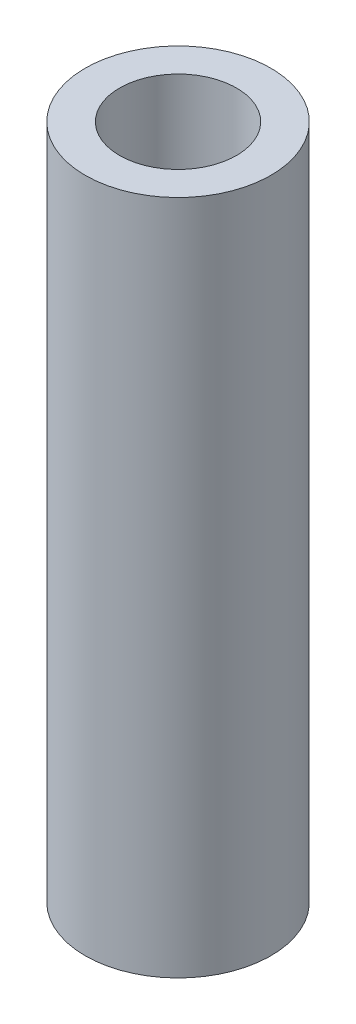
ISO-10303-21;
HEADER;
FILE_DESCRIPTION(('STEP AP214'),'2;1');
FILE_NAME('part.step','',(''),(''),'','','');
FILE_SCHEMA(('AUTOMOTIVE_DESIGN { 1 0 10303 214 1 1 1 1 }'));
ENDSEC;
DATA;
#1=APPLICATION_CONTEXT('core data for automotive mechanical design processes');
#2=APPLICATION_PROTOCOL_DEFINITION('international standard','automotive_design',2000,#1);
#3=PRODUCT_CONTEXT('',#1,'mechanical');
#4=PRODUCT('Part','Part','',(#3));
#5=PRODUCT_RELATED_PRODUCT_CATEGORY('part','',(#4));
#6=PRODUCT_DEFINITION_FORMATION('','',#4);
#7=PRODUCT_DEFINITION_CONTEXT('part definition',#1,'design');
#8=PRODUCT_DEFINITION('design','',#6,#7);
#9=PRODUCT_DEFINITION_SHAPE('','',#8);
#10=(LENGTH_UNIT() NAMED_UNIT(*) SI_UNIT(.MILLI.,.METRE.));
#11=(NAMED_UNIT(*) PLANE_ANGLE_UNIT() SI_UNIT($,.RADIAN.));
#12=(NAMED_UNIT(*) SI_UNIT($,.STERADIAN.) SOLID_ANGLE_UNIT());
#13=UNCERTAINTY_MEASURE_WITH_UNIT(LENGTH_MEASURE(1.E-05),#10,'distance_accuracy_value','');
#14=(GEOMETRIC_REPRESENTATION_CONTEXT(3) GLOBAL_UNCERTAINTY_ASSIGNED_CONTEXT((#13)) GLOBAL_UNIT_ASSIGNED_CONTEXT((#10,
#11,#12)) REPRESENTATION_CONTEXT('',''));
#15=CARTESIAN_POINT('',(0.,0.,0.));
#16=DIRECTION('',(0.,0.,1.));
#17=DIRECTION('',(1.,0.,0.));
#18=AXIS2_PLACEMENT_3D('',#15,#16,#17);
#19=CARTESIAN_POINT('',(0.,-23.114,0.));
#20=DIRECTION('',(0.,1.,0.));
#21=DIRECTION('',(0.,0.,1.));
#22=AXIS2_PLACEMENT_3D('',#19,#20,#21);
#23=CYLINDRICAL_SURFACE('',#22,3.175);
#24=CARTESIAN_POINT('',(0.,-23.114,0.));
#25=DIRECTION('',(0.,1.,0.));
#26=DIRECTION('',(0.,0.,1.));
#27=AXIS2_PLACEMENT_3D('',#24,#25,#26);
#28=CIRCLE('',#27,3.175);
#29=CARTESIAN_POINT('',(0.,-23.114,3.175));
#30=VERTEX_POINT('',#29);
#31=EDGE_CURVE('E10',#30,#30,#28,.T.);
#32=ORIENTED_EDGE('',*,*,#31,.T.);
#33=EDGE_LOOP('',(#32));
#34=FACE_BOUND('',#33,.T.);
#35=CARTESIAN_POINT('',(0.,0.,0.));
#36=DIRECTION('',(0.,1.,0.));
#37=DIRECTION('',(0.,0.,1.));
#38=AXIS2_PLACEMENT_3D('',#35,#36,#37);
#39=CIRCLE('',#38,3.175);
#40=CARTESIAN_POINT('',(0.,0.,3.175));
#41=VERTEX_POINT('',#40);
#42=EDGE_CURVE('E42',#41,#41,#39,.T.);
#43=ORIENTED_EDGE('',*,*,#42,.F.);
#44=EDGE_LOOP('',(#43));
#45=FACE_BOUND('',#44,.T.);
#46=ADVANCED_FACE('F39',(#34,#45),#23,.T.);
#47=CARTESIAN_POINT('',(0.,-23.114,0.));
#48=DIRECTION('',(0.,1.,0.));
#49=DIRECTION('',(0.,0.,1.));
#50=AXIS2_PLACEMENT_3D('',#47,#48,#49);
#51=PLANE('',#50);
#52=CARTESIAN_POINT('',(0.,-23.114,0.));
#53=DIRECTION('',(0.,1.,0.));
#54=DIRECTION('',(0.,0.,1.));
#55=AXIS2_PLACEMENT_3D('',#52,#53,#54);
#56=CIRCLE('',#55,2.);
#57=CARTESIAN_POINT('',(0.,-23.114,2.));
#58=VERTEX_POINT('',#57);
#59=EDGE_CURVE('E49',#58,#58,#56,.T.);
#60=ORIENTED_EDGE('',*,*,#59,.T.);
#61=EDGE_LOOP('',(#60));
#62=FACE_BOUND('',#61,.T.);
#63=ORIENTED_EDGE('',*,*,#31,.F.);
#64=EDGE_LOOP('',(#63));
#65=FACE_BOUND('',#64,.T.);
#66=ADVANCED_FACE('F57',(#62,#65),#51,.F.);
#67=CARTESIAN_POINT('',(0.,0.,0.));
#68=DIRECTION('',(0.,1.,0.));
#69=DIRECTION('',(0.,0.,1.));
#70=AXIS2_PLACEMENT_3D('',#67,#68,#69);
#71=PLANE('',#70);
#72=CARTESIAN_POINT('',(0.,0.,0.));
#73=DIRECTION('',(0.,1.,0.));
#74=DIRECTION('',(0.,0.,1.));
#75=AXIS2_PLACEMENT_3D('',#72,#73,#74);
#76=CIRCLE('',#75,2.);
#77=CARTESIAN_POINT('',(0.,0.,2.));
#78=VERTEX_POINT('',#77);
#79=EDGE_CURVE('E51',#78,#78,#76,.T.);
#80=ORIENTED_EDGE('',*,*,#79,.F.);
#81=EDGE_LOOP('',(#80));
#82=FACE_BOUND('',#81,.T.);
#83=ORIENTED_EDGE('',*,*,#42,.T.);
#84=EDGE_LOOP('',(#83));
#85=FACE_BOUND('',#84,.T.);
#86=ADVANCED_FACE('F63',(#82,#85),#71,.T.);
#87=CARTESIAN_POINT('',(0.,-23.114,0.));
#88=DIRECTION('',(0.,1.,0.));
#89=DIRECTION('',(0.,0.,1.));
#90=AXIS2_PLACEMENT_3D('',#87,#88,#89);
#91=CYLINDRICAL_SURFACE('',#90,2.);
#92=ORIENTED_EDGE('',*,*,#59,.F.);
#93=EDGE_LOOP('',(#92));
#94=FACE_BOUND('',#93,.T.);
#95=ORIENTED_EDGE('',*,*,#79,.T.);
#96=EDGE_LOOP('',(#95));
#97=FACE_BOUND('',#96,.T.);
#98=ADVANCED_FACE('F60',(#94,#97),#91,.F.);
#99=CLOSED_SHELL('',(#46,#66,#86,#98));
#100=MANIFOLD_SOLID_BREP('B2',#99);
#101=ADVANCED_BREP_SHAPE_REPRESENTATION('',(#18,#100),#14);
#102=SHAPE_DEFINITION_REPRESENTATION(#9,#101);
ENDSEC;
END-ISO-10303-21;
